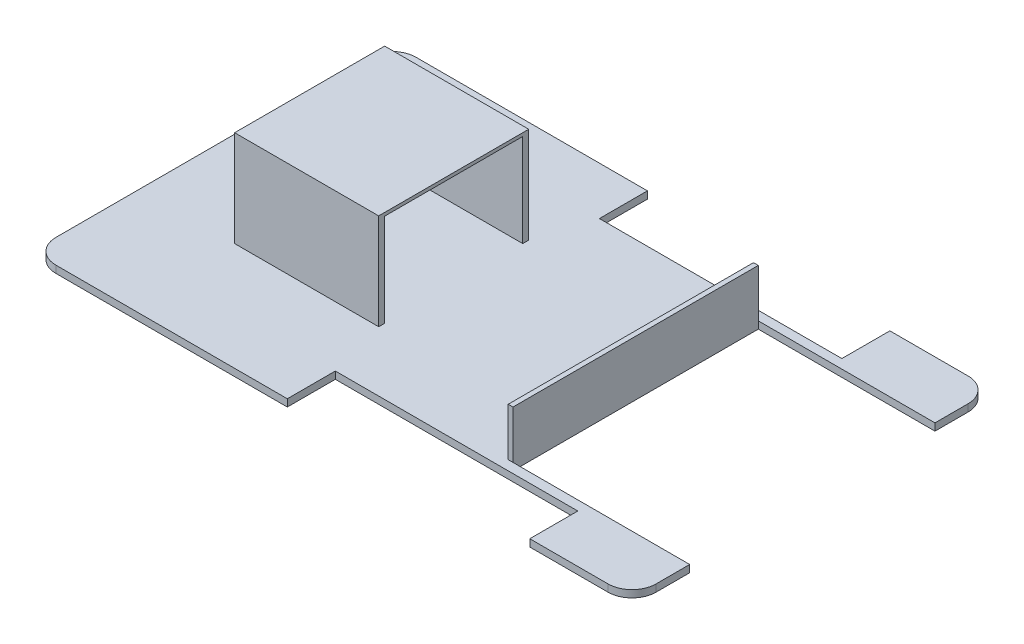
ISO-10303-21;
HEADER;
FILE_DESCRIPTION(('STEP AP214'),'2;1');
FILE_NAME('part.step','',(''),(''),'','','');
FILE_SCHEMA(('AUTOMOTIVE_DESIGN { 1 0 10303 214 1 1 1 1 }'));
ENDSEC;
DATA;
#1=APPLICATION_CONTEXT('core data for automotive mechanical design processes');
#2=APPLICATION_PROTOCOL_DEFINITION('international standard','automotive_design',2000,#1);
#3=PRODUCT_CONTEXT('',#1,'mechanical');
#4=PRODUCT('Part','Part','',(#3));
#5=PRODUCT_RELATED_PRODUCT_CATEGORY('part','',(#4));
#6=PRODUCT_DEFINITION_FORMATION('','',#4);
#7=PRODUCT_DEFINITION_CONTEXT('part definition',#1,'design');
#8=PRODUCT_DEFINITION('design','',#6,#7);
#9=PRODUCT_DEFINITION_SHAPE('','',#8);
#10=(LENGTH_UNIT() NAMED_UNIT(*) SI_UNIT(.MILLI.,.METRE.));
#11=(NAMED_UNIT(*) PLANE_ANGLE_UNIT() SI_UNIT($,.RADIAN.));
#12=(NAMED_UNIT(*) SI_UNIT($,.STERADIAN.) SOLID_ANGLE_UNIT());
#13=UNCERTAINTY_MEASURE_WITH_UNIT(LENGTH_MEASURE(1.E-05),#10,'distance_accuracy_value','');
#14=(GEOMETRIC_REPRESENTATION_CONTEXT(3) GLOBAL_UNCERTAINTY_ASSIGNED_CONTEXT((#13)) GLOBAL_UNIT_ASSIGNED_CONTEXT((#10,
#11,#12)) REPRESENTATION_CONTEXT('',''));
#15=CARTESIAN_POINT('',(0.,0.,0.));
#16=DIRECTION('',(0.,0.,1.));
#17=DIRECTION('',(1.,0.,0.));
#18=AXIS2_PLACEMENT_3D('',#15,#16,#17);
#19=CARTESIAN_POINT('',(0.,3.,0.));
#20=DIRECTION('',(0.,-1.,0.));
#21=DIRECTION('',(0.,0.,-1.));
#22=AXIS2_PLACEMENT_3D('',#19,#20,#21);
#23=PLANE('',#22);
#24=DIRECTION('',(0.,0.,-1.));
#25=VECTOR('',#24,1.);
#26=CARTESIAN_POINT('',(99.4609846046097,3.,-105.));
#27=LINE('',#26,#25);
#28=CARTESIAN_POINT('',(99.4609846046097,3.,-105.));
#29=VERTEX_POINT('',#28);
#30=CARTESIAN_POINT('',(99.4609846046097,3.,-107.5));
#31=VERTEX_POINT('',#30);
#32=EDGE_CURVE('E270',#29,#31,#27,.T.);
#33=ORIENTED_EDGE('',*,*,#32,.F.);
#34=DIRECTION('',(1.,0.,0.));
#35=VECTOR('',#34,1.);
#36=CARTESIAN_POINT('',(99.4609846046097,3.,-105.));
#37=LINE('',#36,#35);
#38=CARTESIAN_POINT('',(39.4609846046098,3.,-105.));
#39=VERTEX_POINT('',#38);
#40=EDGE_CURVE('E279',#39,#29,#37,.T.);
#41=ORIENTED_EDGE('',*,*,#40,.F.);
#42=DIRECTION('',(0.,0.,1.));
#43=VECTOR('',#42,1.);
#44=CARTESIAN_POINT('',(39.4609846046098,3.,-105.));
#45=LINE('',#44,#43);
#46=CARTESIAN_POINT('',(39.4609846046098,3.,-107.5));
#47=VERTEX_POINT('',#46);
#48=EDGE_CURVE('E285',#47,#39,#45,.T.);
#49=ORIENTED_EDGE('',*,*,#48,.F.);
#50=DIRECTION('',(-1.,0.,0.));
#51=VECTOR('',#50,1.);
#52=CARTESIAN_POINT('',(99.4609846046097,3.,-107.5));
#53=LINE('',#52,#51);
#54=EDGE_CURVE('E282',#31,#47,#53,.T.);
#55=ORIENTED_EDGE('',*,*,#54,.F.);
#56=EDGE_LOOP('',(#33,#41,#49,#55));
#57=FACE_BOUND('',#56,.T.);
#58=DIRECTION('',(0.,0.,-1.));
#59=VECTOR('',#58,1.);
#60=CARTESIAN_POINT('',(99.4609846046097,3.,-47.5));
#61=LINE('',#60,#59);
#62=CARTESIAN_POINT('',(99.4609846046097,3.,-45.));
#63=VERTEX_POINT('',#62);
#64=CARTESIAN_POINT('',(99.4609846046097,3.,-47.5));
#65=VERTEX_POINT('',#64);
#66=EDGE_CURVE('E299',#63,#65,#61,.T.);
#67=ORIENTED_EDGE('',*,*,#66,.F.);
#68=DIRECTION('',(1.,0.,0.));
#69=VECTOR('',#68,1.);
#70=CARTESIAN_POINT('',(99.4609846046097,3.,-45.));
#71=LINE('',#70,#69);
#72=CARTESIAN_POINT('',(39.4609846046098,3.,-45.));
#73=VERTEX_POINT('',#72);
#74=EDGE_CURVE('E303',#73,#63,#71,.T.);
#75=ORIENTED_EDGE('',*,*,#74,.F.);
#76=DIRECTION('',(0.,0.,1.));
#77=VECTOR('',#76,1.);
#78=CARTESIAN_POINT('',(39.4609846046098,3.,-47.5));
#79=LINE('',#78,#77);
#80=CARTESIAN_POINT('',(39.4609846046098,3.,-47.5));
#81=VERTEX_POINT('',#80);
#82=EDGE_CURVE('E313',#81,#73,#79,.T.);
#83=ORIENTED_EDGE('',*,*,#82,.F.);
#84=DIRECTION('',(-1.,0.,0.));
#85=VECTOR('',#84,1.);
#86=CARTESIAN_POINT('',(99.4609846046097,3.,-47.5));
#87=LINE('',#86,#85);
#88=EDGE_CURVE('E310',#65,#81,#87,.T.);
#89=ORIENTED_EDGE('',*,*,#88,.F.);
#90=EDGE_LOOP('',(#67,#75,#83,#89));
#91=FACE_BOUND('',#90,.T.);
#92=DIRECTION('',(-1.,0.,0.));
#93=VECTOR('',#92,1.);
#94=CARTESIAN_POINT('',(176.397365129354,3.,-126.191511829194));
#95=LINE('',#94,#93);
#96=CARTESIAN_POINT('',(176.397365129354,3.,-126.191511829194));
#97=VERTEX_POINT('',#96);
#98=CARTESIAN_POINT('',(174.397365129354,3.,-126.191511829194));
#99=VERTEX_POINT('',#98);
#100=EDGE_CURVE('E531',#97,#99,#95,.T.);
#101=ORIENTED_EDGE('',*,*,#100,.F.);
#102=DIRECTION('',(1.,0.,0.));
#103=VECTOR('',#102,1.);
#104=CARTESIAN_POINT('',(250.,3.,-126.191511829194));
#105=LINE('',#104,#103);
#106=CARTESIAN_POINT('',(250.,3.,-126.191511829194));
#107=VERTEX_POINT('',#106);
#108=EDGE_CURVE('E347',#97,#107,#105,.T.);
#109=ORIENTED_EDGE('',*,*,#108,.T.);
#110=DIRECTION('',(0.,0.,-1.));
#111=VECTOR('',#110,1.);
#112=CARTESIAN_POINT('',(250.,3.,-126.191511829194));
#113=LINE('',#112,#111);
#114=CARTESIAN_POINT('',(250.,3.,-140.));
#115=VERTEX_POINT('',#114);
#116=EDGE_CURVE('E349',#107,#115,#113,.T.);
#117=ORIENTED_EDGE('',*,*,#116,.T.);
#118=CARTESIAN_POINT('',(240.,3.,-140.));
#119=DIRECTION('',(0.,-1.,0.));
#120=DIRECTION('',(0.,0.,-1.));
#121=AXIS2_PLACEMENT_3D('',#118,#119,#120);
#122=CIRCLE('',#121,10.);
#123=CARTESIAN_POINT('',(240.,3.,-150.));
#124=VERTEX_POINT('',#123);
#125=EDGE_CURVE('E450',#115,#124,#122,.F.);
#126=ORIENTED_EDGE('',*,*,#125,.T.);
#127=DIRECTION('',(-1.,0.,0.));
#128=VECTOR('',#127,1.);
#129=CARTESIAN_POINT('',(207.407471576062,3.,-150.));
#130=LINE('',#129,#128);
#131=CARTESIAN_POINT('',(207.407471576062,3.,-150.));
#132=VERTEX_POINT('',#131);
#133=EDGE_CURVE('E352',#124,#132,#130,.T.);
#134=ORIENTED_EDGE('',*,*,#133,.T.);
#135=DIRECTION('',(0.,0.,1.));
#136=VECTOR('',#135,1.);
#137=CARTESIAN_POINT('',(207.407471576062,3.,-150.));
#138=LINE('',#137,#136);
#139=CARTESIAN_POINT('',(207.407471576062,3.,-130.));
#140=VERTEX_POINT('',#139);
#141=EDGE_CURVE('E354',#132,#140,#138,.T.);
#142=ORIENTED_EDGE('',*,*,#141,.T.);
#143=DIRECTION('',(-1.,0.,0.));
#144=VECTOR('',#143,1.);
#145=CARTESIAN_POINT('',(106.407471576062,3.,-130.));
#146=LINE('',#145,#144);
#147=CARTESIAN_POINT('',(106.407471576062,3.,-130.));
#148=VERTEX_POINT('',#147);
#149=EDGE_CURVE('E356',#140,#148,#146,.T.);
#150=ORIENTED_EDGE('',*,*,#149,.T.);
#151=DIRECTION('',(0.,0.,-1.));
#152=VECTOR('',#151,1.);
#153=CARTESIAN_POINT('',(106.407471576062,3.,-150.));
#154=LINE('',#153,#152);
#155=CARTESIAN_POINT('',(106.407471576062,3.,-150.));
#156=VERTEX_POINT('',#155);
#157=EDGE_CURVE('E358',#148,#156,#154,.T.);
#158=ORIENTED_EDGE('',*,*,#157,.T.);
#159=DIRECTION('',(-1.,0.,0.));
#160=VECTOR('',#159,1.);
#161=CARTESIAN_POINT('',(0.,3.,-150.));
#162=LINE('',#161,#160);
#163=CARTESIAN_POINT('',(10.,3.,-150.));
#164=VERTEX_POINT('',#163);
#165=EDGE_CURVE('E360',#156,#164,#162,.T.);
#166=ORIENTED_EDGE('',*,*,#165,.T.);
#167=CARTESIAN_POINT('',(10.,3.,-140.));
#168=DIRECTION('',(0.,-1.,0.));
#169=DIRECTION('',(0.,0.,-1.));
#170=AXIS2_PLACEMENT_3D('',#167,#168,#169);
#171=CIRCLE('',#170,10.);
#172=CARTESIAN_POINT('',(0.,3.,-140.));
#173=VERTEX_POINT('',#172);
#174=EDGE_CURVE('E446',#164,#173,#171,.F.);
#175=ORIENTED_EDGE('',*,*,#174,.T.);
#176=DIRECTION('',(0.,0.,1.));
#177=VECTOR('',#176,1.);
#178=CARTESIAN_POINT('',(0.,3.,0.));
#179=LINE('',#178,#177);
#180=CARTESIAN_POINT('',(0.,3.,-10.));
#181=VERTEX_POINT('',#180);
#182=EDGE_CURVE('E328',#173,#181,#179,.T.);
#183=ORIENTED_EDGE('',*,*,#182,.T.);
#184=CARTESIAN_POINT('',(10.,3.,-10.));
#185=DIRECTION('',(0.,-1.,0.));
#186=DIRECTION('',(0.,0.,-1.));
#187=AXIS2_PLACEMENT_3D('',#184,#185,#186);
#188=CIRCLE('',#187,10.);
#189=CARTESIAN_POINT('',(10.,3.,0.));
#190=VERTEX_POINT('',#189);
#191=EDGE_CURVE('E444',#181,#190,#188,.F.);
#192=ORIENTED_EDGE('',*,*,#191,.T.);
#193=DIRECTION('',(1.,0.,0.));
#194=VECTOR('',#193,1.);
#195=CARTESIAN_POINT('',(0.,3.,0.));
#196=LINE('',#195,#194);
#197=CARTESIAN_POINT('',(106.407471576062,3.,0.));
#198=VERTEX_POINT('',#197);
#199=EDGE_CURVE('E331',#190,#198,#196,.T.);
#200=ORIENTED_EDGE('',*,*,#199,.T.);
#201=DIRECTION('',(0.,0.,-1.));
#202=VECTOR('',#201,1.);
#203=CARTESIAN_POINT('',(106.407471576062,3.,-20.));
#204=LINE('',#203,#202);
#205=CARTESIAN_POINT('',(106.407471576062,3.,-20.));
#206=VERTEX_POINT('',#205);
#207=EDGE_CURVE('E334',#198,#206,#204,.T.);
#208=ORIENTED_EDGE('',*,*,#207,.T.);
#209=DIRECTION('',(1.,0.,0.));
#210=VECTOR('',#209,1.);
#211=CARTESIAN_POINT('',(106.407471576062,3.,-20.));
#212=LINE('',#211,#210);
#213=CARTESIAN_POINT('',(207.407471576062,3.,-20.));
#214=VERTEX_POINT('',#213);
#215=EDGE_CURVE('E336',#206,#214,#212,.T.);
#216=ORIENTED_EDGE('',*,*,#215,.T.);
#217=DIRECTION('',(0.,0.,1.));
#218=VECTOR('',#217,1.);
#219=CARTESIAN_POINT('',(207.407471576062,3.,-20.));
#220=LINE('',#219,#218);
#221=CARTESIAN_POINT('',(207.407471576062,3.,0.));
#222=VERTEX_POINT('',#221);
#223=EDGE_CURVE('E338',#214,#222,#220,.T.);
#224=ORIENTED_EDGE('',*,*,#223,.T.);
#225=DIRECTION('',(1.,0.,0.));
#226=VECTOR('',#225,1.);
#227=CARTESIAN_POINT('',(207.407471576062,3.,0.));
#228=LINE('',#227,#226);
#229=CARTESIAN_POINT('',(240.,3.,0.));
#230=VERTEX_POINT('',#229);
#231=EDGE_CURVE('E340',#222,#230,#228,.T.);
#232=ORIENTED_EDGE('',*,*,#231,.T.);
#233=CARTESIAN_POINT('',(240.,3.,-10.));
#234=DIRECTION('',(0.,-1.,0.));
#235=DIRECTION('',(0.,0.,-1.));
#236=AXIS2_PLACEMENT_3D('',#233,#234,#235);
#237=CIRCLE('',#236,10.);
#238=CARTESIAN_POINT('',(250.,3.,-10.));
#239=VERTEX_POINT('',#238);
#240=EDGE_CURVE('E448',#230,#239,#237,.F.);
#241=ORIENTED_EDGE('',*,*,#240,.T.);
#242=DIRECTION('',(0.,0.,-1.));
#243=VECTOR('',#242,1.);
#244=CARTESIAN_POINT('',(250.,3.,0.));
#245=LINE('',#244,#243);
#246=CARTESIAN_POINT('',(250.,3.,-24.0220281720691));
#247=VERTEX_POINT('',#246);
#248=EDGE_CURVE('E343',#239,#247,#245,.T.);
#249=ORIENTED_EDGE('',*,*,#248,.T.);
#250=DIRECTION('',(-1.,0.,0.));
#251=VECTOR('',#250,1.);
#252=CARTESIAN_POINT('',(250.,3.,-24.0220281720691));
#253=LINE('',#252,#251);
#254=CARTESIAN_POINT('',(176.397365129354,3.,-24.0220281720691));
#255=VERTEX_POINT('',#254);
#256=EDGE_CURVE('E345',#247,#255,#253,.T.);
#257=ORIENTED_EDGE('',*,*,#256,.T.);
#258=DIRECTION('',(1.,0.,0.));
#259=VECTOR('',#258,1.);
#260=CARTESIAN_POINT('',(176.397365129354,3.,-24.0220281720691));
#261=LINE('',#260,#259);
#262=CARTESIAN_POINT('',(174.397365129354,3.,-24.0220281720691));
#263=VERTEX_POINT('',#262);
#264=EDGE_CURVE('E53',#263,#255,#261,.T.);
#265=ORIENTED_EDGE('',*,*,#264,.F.);
#266=DIRECTION('',(0.,0.,1.));
#267=VECTOR('',#266,1.);
#268=CARTESIAN_POINT('',(174.397365129354,3.,-126.191511829194));
#269=LINE('',#268,#267);
#270=EDGE_CURVE('E48',#99,#263,#269,.T.);
#271=ORIENTED_EDGE('',*,*,#270,.F.);
#272=EDGE_LOOP('',(#101,#109,#117,#126,#134,#142,#150,#158,#166,#175,#183,#192,#200,#208,#216,
#224,#232,#241,#249,#257,#265,#271));
#273=FACE_BOUND('',#272,.T.);
#274=ADVANCED_FACE('F33',(#57,#91,#273),#23,.F.);
#275=CARTESIAN_POINT('',(99.4609846046097,43.,-47.5));
#276=DIRECTION('',(0.,0.,1.));
#277=DIRECTION('',(1.,0.,0.));
#278=AXIS2_PLACEMENT_3D('',#275,#276,#277);
#279=PLANE('',#278);
#280=DIRECTION('',(-1.,0.,0.));
#281=VECTOR('',#280,1.);
#282=CARTESIAN_POINT('',(99.4609846046097,41.6403706407777,-47.5));
#283=LINE('',#282,#281);
#284=CARTESIAN_POINT('',(99.4609846046097,41.6403706407777,-47.5));
#285=VERTEX_POINT('',#284);
#286=CARTESIAN_POINT('',(39.4609846046098,41.6403706407777,-47.5));
#287=VERTEX_POINT('',#286);
#288=EDGE_CURVE('E268',#285,#287,#283,.T.);
#289=ORIENTED_EDGE('',*,*,#288,.F.);
#290=DIRECTION('',(0.,-1.,0.));
#291=VECTOR('',#290,1.);
#292=CARTESIAN_POINT('',(99.4609846046097,43.,-47.5));
#293=LINE('',#292,#291);
#294=EDGE_CURVE('E325',#285,#65,#293,.T.);
#295=ORIENTED_EDGE('',*,*,#294,.T.);
#296=ORIENTED_EDGE('',*,*,#88,.T.);
#297=DIRECTION('',(0.,-1.,0.));
#298=VECTOR('',#297,1.);
#299=CARTESIAN_POINT('',(39.4609846046098,43.,-47.5));
#300=LINE('',#299,#298);
#301=EDGE_CURVE('E323',#287,#81,#300,.T.);
#302=ORIENTED_EDGE('',*,*,#301,.F.);
#303=EDGE_LOOP('',(#289,#295,#296,#302));
#304=FACE_BOUND('',#303,.T.);
#305=ADVANCED_FACE('F546',(#304),#279,.F.);
#306=CARTESIAN_POINT('',(99.4609846046097,43.,-105.));
#307=DIRECTION('',(0.,0.,-1.));
#308=DIRECTION('',(-1.,0.,0.));
#309=AXIS2_PLACEMENT_3D('',#306,#307,#308);
#310=PLANE('',#309);
#311=DIRECTION('',(-1.,0.,0.));
#312=VECTOR('',#311,1.);
#313=CARTESIAN_POINT('',(99.4609846046097,41.6403706407777,-105.));
#314=LINE('',#313,#312);
#315=CARTESIAN_POINT('',(99.4609846046097,41.6403706407777,-105.));
#316=VERTEX_POINT('',#315);
#317=CARTESIAN_POINT('',(39.4609846046098,41.6403706407777,-105.));
#318=VERTEX_POINT('',#317);
#319=EDGE_CURVE('E259',#316,#318,#314,.T.);
#320=ORIENTED_EDGE('',*,*,#319,.T.);
#321=DIRECTION('',(0.,-1.,0.));
#322=VECTOR('',#321,1.);
#323=CARTESIAN_POINT('',(39.4609846046098,43.,-105.));
#324=LINE('',#323,#322);
#325=EDGE_CURVE('E291',#318,#39,#324,.T.);
#326=ORIENTED_EDGE('',*,*,#325,.T.);
#327=ORIENTED_EDGE('',*,*,#40,.T.);
#328=DIRECTION('',(0.,-1.,0.));
#329=VECTOR('',#328,1.);
#330=CARTESIAN_POINT('',(99.4609846046097,43.,-105.));
#331=LINE('',#330,#329);
#332=EDGE_CURVE('E278',#316,#29,#331,.T.);
#333=ORIENTED_EDGE('',*,*,#332,.F.);
#334=EDGE_LOOP('',(#320,#326,#327,#333));
#335=FACE_BOUND('',#334,.T.);
#336=ADVANCED_FACE('F552',(#335),#310,.F.);
#337=CARTESIAN_POINT('',(0.,3.,0.));
#338=DIRECTION('',(1.,0.,0.));
#339=DIRECTION('',(0.,0.,-1.));
#340=AXIS2_PLACEMENT_3D('',#337,#338,#339);
#341=PLANE('',#340);
#342=ORIENTED_EDGE('',*,*,#182,.F.);
#343=DIRECTION('',(0.,-1.,0.));
#344=VECTOR('',#343,1.);
#345=CARTESIAN_POINT('',(0.,3.,-140.));
#346=LINE('',#345,#344);
#347=CARTESIAN_POINT('',(0.,0.,-140.));
#348=VERTEX_POINT('',#347);
#349=EDGE_CURVE('E459',#173,#348,#346,.T.);
#350=ORIENTED_EDGE('',*,*,#349,.T.);
#351=DIRECTION('',(0.,0.,1.));
#352=VECTOR('',#351,1.);
#353=CARTESIAN_POINT('',(0.,0.,0.));
#354=LINE('',#353,#352);
#355=CARTESIAN_POINT('',(0.,0.,-10.));
#356=VERTEX_POINT('',#355);
#357=EDGE_CURVE('E327',#348,#356,#354,.T.);
#358=ORIENTED_EDGE('',*,*,#357,.T.);
#359=DIRECTION('',(0.,-1.,0.));
#360=VECTOR('',#359,1.);
#361=CARTESIAN_POINT('',(0.,3.,-10.));
#362=LINE('',#361,#360);
#363=EDGE_CURVE('E457',#356,#181,#362,.F.);
#364=ORIENTED_EDGE('',*,*,#363,.T.);
#365=EDGE_LOOP('',(#342,#350,#358,#364));
#366=FACE_BOUND('',#365,.T.);
#367=ADVANCED_FACE('F475',(#366),#341,.F.);
#368=CARTESIAN_POINT('',(0.,3.,0.));
#369=DIRECTION('',(0.,0.,-1.));
#370=DIRECTION('',(-1.,0.,0.));
#371=AXIS2_PLACEMENT_3D('',#368,#369,#370);
#372=PLANE('',#371);
#373=ORIENTED_EDGE('',*,*,#199,.F.);
#374=DIRECTION('',(0.,-1.,0.));
#375=VECTOR('',#374,1.);
#376=CARTESIAN_POINT('',(10.,3.,0.));
#377=LINE('',#376,#375);
#378=CARTESIAN_POINT('',(10.,0.,0.));
#379=VERTEX_POINT('',#378);
#380=EDGE_CURVE('E11',#190,#379,#377,.T.);
#381=ORIENTED_EDGE('',*,*,#380,.T.);
#382=DIRECTION('',(1.,0.,0.));
#383=VECTOR('',#382,1.);
#384=CARTESIAN_POINT('',(0.,0.,0.));
#385=LINE('',#384,#383);
#386=CARTESIAN_POINT('',(106.407471576062,0.,0.));
#387=VERTEX_POINT('',#386);
#388=EDGE_CURVE('E366',#379,#387,#385,.T.);
#389=ORIENTED_EDGE('',*,*,#388,.T.);
#390=DIRECTION('',(0.,-1.,0.));
#391=VECTOR('',#390,1.);
#392=CARTESIAN_POINT('',(106.407471576062,3.,0.));
#393=LINE('',#392,#391);
#394=EDGE_CURVE('E428',#198,#387,#393,.T.);
#395=ORIENTED_EDGE('',*,*,#394,.F.);
#396=EDGE_LOOP('',(#373,#381,#389,#395));
#397=FACE_BOUND('',#396,.T.);
#398=ADVANCED_FACE('F487',(#397),#372,.F.);
#399=CARTESIAN_POINT('',(106.407471576062,3.,-20.));
#400=DIRECTION('',(-1.,0.,0.));
#401=DIRECTION('',(0.,0.,1.));
#402=AXIS2_PLACEMENT_3D('',#399,#400,#401);
#403=PLANE('',#402);
#404=DIRECTION('',(0.,0.,-1.));
#405=VECTOR('',#404,1.);
#406=CARTESIAN_POINT('',(106.407471576062,0.,-20.));
#407=LINE('',#406,#405);
#408=CARTESIAN_POINT('',(106.407471576062,0.,-20.));
#409=VERTEX_POINT('',#408);
#410=EDGE_CURVE('E368',#387,#409,#407,.T.);
#411=ORIENTED_EDGE('',*,*,#410,.T.);
#412=DIRECTION('',(0.,-1.,0.));
#413=VECTOR('',#412,1.);
#414=CARTESIAN_POINT('',(106.407471576062,3.,-20.));
#415=LINE('',#414,#413);
#416=EDGE_CURVE('E425',#206,#409,#415,.T.);
#417=ORIENTED_EDGE('',*,*,#416,.F.);
#418=ORIENTED_EDGE('',*,*,#207,.F.);
#419=ORIENTED_EDGE('',*,*,#394,.T.);
#420=EDGE_LOOP('',(#411,#417,#418,#419));
#421=FACE_BOUND('',#420,.T.);
#422=ADVANCED_FACE('F494',(#421),#403,.F.);
#423=CARTESIAN_POINT('',(106.407471576062,3.,-20.));
#424=DIRECTION('',(0.,0.,-1.));
#425=DIRECTION('',(-1.,0.,0.));
#426=AXIS2_PLACEMENT_3D('',#423,#424,#425);
#427=PLANE('',#426);
#428=DIRECTION('',(1.,0.,0.));
#429=VECTOR('',#428,1.);
#430=CARTESIAN_POINT('',(106.407471576062,0.,-20.));
#431=LINE('',#430,#429);
#432=CARTESIAN_POINT('',(207.407471576062,0.,-20.));
#433=VERTEX_POINT('',#432);
#434=EDGE_CURVE('E370',#409,#433,#431,.T.);
#435=ORIENTED_EDGE('',*,*,#434,.T.);
#436=DIRECTION('',(0.,-1.,0.));
#437=VECTOR('',#436,1.);
#438=CARTESIAN_POINT('',(207.407471576062,3.,-20.));
#439=LINE('',#438,#437);
#440=EDGE_CURVE('E422',#214,#433,#439,.T.);
#441=ORIENTED_EDGE('',*,*,#440,.F.);
#442=ORIENTED_EDGE('',*,*,#215,.F.);
#443=ORIENTED_EDGE('',*,*,#416,.T.);
#444=EDGE_LOOP('',(#435,#441,#442,#443));
#445=FACE_BOUND('',#444,.T.);
#446=ADVANCED_FACE('F497',(#445),#427,.F.);
#447=CARTESIAN_POINT('',(207.407471576062,3.,-20.));
#448=DIRECTION('',(1.,0.,0.));
#449=DIRECTION('',(0.,0.,-1.));
#450=AXIS2_PLACEMENT_3D('',#447,#448,#449);
#451=PLANE('',#450);
#452=DIRECTION('',(0.,0.,1.));
#453=VECTOR('',#452,1.);
#454=CARTESIAN_POINT('',(207.407471576062,0.,-20.));
#455=LINE('',#454,#453);
#456=CARTESIAN_POINT('',(207.407471576062,0.,0.));
#457=VERTEX_POINT('',#456);
#458=EDGE_CURVE('E372',#433,#457,#455,.T.);
#459=ORIENTED_EDGE('',*,*,#458,.T.);
#460=DIRECTION('',(0.,-1.,0.));
#461=VECTOR('',#460,1.);
#462=CARTESIAN_POINT('',(207.407471576062,3.,0.));
#463=LINE('',#462,#461);
#464=EDGE_CURVE('E419',#222,#457,#463,.T.);
#465=ORIENTED_EDGE('',*,*,#464,.F.);
#466=ORIENTED_EDGE('',*,*,#223,.F.);
#467=ORIENTED_EDGE('',*,*,#440,.T.);
#468=EDGE_LOOP('',(#459,#465,#466,#467));
#469=FACE_BOUND('',#468,.T.);
#470=ADVANCED_FACE('F502',(#469),#451,.F.);
#471=CARTESIAN_POINT('',(207.407471576062,3.,0.));
#472=DIRECTION('',(0.,0.,-1.));
#473=DIRECTION('',(-1.,0.,0.));
#474=AXIS2_PLACEMENT_3D('',#471,#472,#473);
#475=PLANE('',#474);
#476=DIRECTION('',(1.,0.,0.));
#477=VECTOR('',#476,1.);
#478=CARTESIAN_POINT('',(207.407471576062,0.,0.));
#479=LINE('',#478,#477);
#480=CARTESIAN_POINT('',(240.,0.,0.));
#481=VERTEX_POINT('',#480);
#482=EDGE_CURVE('E374',#457,#481,#479,.T.);
#483=ORIENTED_EDGE('',*,*,#482,.T.);
#484=DIRECTION('',(0.,-1.,0.));
#485=VECTOR('',#484,1.);
#486=CARTESIAN_POINT('',(240.,3.,0.));
#487=LINE('',#486,#485);
#488=EDGE_CURVE('E455',#481,#230,#487,.F.);
#489=ORIENTED_EDGE('',*,*,#488,.T.);
#490=ORIENTED_EDGE('',*,*,#231,.F.);
#491=ORIENTED_EDGE('',*,*,#464,.T.);
#492=EDGE_LOOP('',(#483,#489,#490,#491));
#493=FACE_BOUND('',#492,.T.);
#494=ADVANCED_FACE('F594',(#493),#475,.F.);
#495=CARTESIAN_POINT('',(250.,3.,0.));
#496=DIRECTION('',(-1.,0.,0.));
#497=DIRECTION('',(0.,0.,1.));
#498=AXIS2_PLACEMENT_3D('',#495,#496,#497);
#499=PLANE('',#498);
#500=ORIENTED_EDGE('',*,*,#248,.F.);
#501=DIRECTION('',(0.,-1.,0.));
#502=VECTOR('',#501,1.);
#503=CARTESIAN_POINT('',(250.,3.,-10.));
#504=LINE('',#503,#502);
#505=CARTESIAN_POINT('',(250.,0.,-10.));
#506=VERTEX_POINT('',#505);
#507=EDGE_CURVE('E452',#239,#506,#504,.T.);
#508=ORIENTED_EDGE('',*,*,#507,.T.);
#509=DIRECTION('',(0.,0.,-1.));
#510=VECTOR('',#509,1.);
#511=CARTESIAN_POINT('',(250.,0.,0.));
#512=LINE('',#511,#510);
#513=CARTESIAN_POINT('',(250.,0.,-24.0220281720691));
#514=VERTEX_POINT('',#513);
#515=EDGE_CURVE('E377',#506,#514,#512,.T.);
#516=ORIENTED_EDGE('',*,*,#515,.T.);
#517=DIRECTION('',(0.,-1.,0.));
#518=VECTOR('',#517,1.);
#519=CARTESIAN_POINT('',(250.,3.,-24.0220281720691));
#520=LINE('',#519,#518);
#521=EDGE_CURVE('E416',#247,#514,#520,.T.);
#522=ORIENTED_EDGE('',*,*,#521,.F.);
#523=EDGE_LOOP('',(#500,#508,#516,#522));
#524=FACE_BOUND('',#523,.T.);
#525=ADVANCED_FACE('F513',(#524),#499,.F.);
#526=CARTESIAN_POINT('',(250.,3.,-24.0220281720691));
#527=DIRECTION('',(0.,0.,1.));
#528=DIRECTION('',(1.,0.,0.));
#529=AXIS2_PLACEMENT_3D('',#526,#527,#528);
#530=PLANE('',#529);
#531=DIRECTION('',(-1.,0.,0.));
#532=VECTOR('',#531,1.);
#533=CARTESIAN_POINT('',(250.,0.,-24.0220281720691));
#534=LINE('',#533,#532);
#535=CARTESIAN_POINT('',(176.397365129354,0.,-24.0220281720691));
#536=VERTEX_POINT('',#535);
#537=EDGE_CURVE('E379',#514,#536,#534,.T.);
#538=ORIENTED_EDGE('',*,*,#537,.T.);
#539=DIRECTION('',(0.,-1.,0.));
#540=VECTOR('',#539,1.);
#541=CARTESIAN_POINT('',(176.397365129354,3.,-24.0220281720691));
#542=LINE('',#541,#540);
#543=EDGE_CURVE('E413',#255,#536,#542,.T.);
#544=ORIENTED_EDGE('',*,*,#543,.F.);
#545=ORIENTED_EDGE('',*,*,#256,.F.);
#546=ORIENTED_EDGE('',*,*,#521,.T.);
#547=EDGE_LOOP('',(#538,#544,#545,#546));
#548=FACE_BOUND('',#547,.T.);
#549=ADVANCED_FACE('F521',(#548),#530,.F.);
#550=CARTESIAN_POINT('',(176.397365129354,3.,-126.191511829194));
#551=DIRECTION('',(-1.,0.,0.));
#552=DIRECTION('',(0.,0.,1.));
#553=AXIS2_PLACEMENT_3D('',#550,#551,#552);
#554=PLANE('',#553);
#555=DIRECTION('',(0.,0.,-1.));
#556=VECTOR('',#555,1.);
#557=CARTESIAN_POINT('',(176.397365129354,0.,-126.191511829194));
#558=LINE('',#557,#556);
#559=CARTESIAN_POINT('',(176.397365129354,0.,-126.191511829194));
#560=VERTEX_POINT('',#559);
#561=EDGE_CURVE('E381',#536,#560,#558,.T.);
#562=ORIENTED_EDGE('',*,*,#561,.T.);
#563=DIRECTION('',(0.,-1.,0.));
#564=VECTOR('',#563,1.);
#565=CARTESIAN_POINT('',(176.397365129354,3.,-126.191511829194));
#566=LINE('',#565,#564);
#567=EDGE_CURVE('E258',#97,#560,#566,.T.);
#568=ORIENTED_EDGE('',*,*,#567,.F.);
#569=DIRECTION('',(0.,-1.,0.));
#570=VECTOR('',#569,1.);
#571=CARTESIAN_POINT('',(176.397365129354,23.,-126.191511829194));
#572=LINE('',#571,#570);
#573=CARTESIAN_POINT('',(176.397365129354,23.,-126.191511829194));
#574=VERTEX_POINT('',#573);
#575=EDGE_CURVE('E239',#574,#97,#572,.T.);
#576=ORIENTED_EDGE('',*,*,#575,.F.);
#577=DIRECTION('',(0.,0.,-1.));
#578=VECTOR('',#577,1.);
#579=CARTESIAN_POINT('',(176.397365129354,23.,-126.191511829194));
#580=LINE('',#579,#578);
#581=CARTESIAN_POINT('',(176.397365129354,23.,-24.0220281720691));
#582=VERTEX_POINT('',#581);
#583=EDGE_CURVE('E245',#582,#574,#580,.T.);
#584=ORIENTED_EDGE('',*,*,#583,.F.);
#585=DIRECTION('',(0.,-1.,0.));
#586=VECTOR('',#585,1.);
#587=CARTESIAN_POINT('',(176.397365129354,23.,-24.0220281720691));
#588=LINE('',#587,#586);
#589=EDGE_CURVE('E523',#582,#255,#588,.T.);
#590=ORIENTED_EDGE('',*,*,#589,.T.);
#591=ORIENTED_EDGE('',*,*,#543,.T.);
#592=EDGE_LOOP('',(#562,#568,#576,#584,#590,#591));
#593=FACE_BOUND('',#592,.T.);
#594=ADVANCED_FACE('F256',(#593),#554,.F.);
#595=CARTESIAN_POINT('',(250.,3.,-126.191511829194));
#596=DIRECTION('',(0.,0.,-1.));
#597=DIRECTION('',(-1.,0.,0.));
#598=AXIS2_PLACEMENT_3D('',#595,#596,#597);
#599=PLANE('',#598);
#600=DIRECTION('',(1.,0.,0.));
#601=VECTOR('',#600,1.);
#602=CARTESIAN_POINT('',(250.,0.,-126.191511829194));
#603=LINE('',#602,#601);
#604=CARTESIAN_POINT('',(250.,0.,-126.191511829194));
#605=VERTEX_POINT('',#604);
#606=EDGE_CURVE('E383',#560,#605,#603,.T.);
#607=ORIENTED_EDGE('',*,*,#606,.T.);
#608=DIRECTION('',(0.,-1.,0.));
#609=VECTOR('',#608,1.);
#610=CARTESIAN_POINT('',(250.,3.,-126.191511829194));
#611=LINE('',#610,#609);
#612=EDGE_CURVE('E409',#107,#605,#611,.T.);
#613=ORIENTED_EDGE('',*,*,#612,.F.);
#614=ORIENTED_EDGE('',*,*,#108,.F.);
#615=ORIENTED_EDGE('',*,*,#567,.T.);
#616=EDGE_LOOP('',(#607,#613,#614,#615));
#617=FACE_BOUND('',#616,.T.);
#618=ADVANCED_FACE('F583',(#617),#599,.F.);
#619=CARTESIAN_POINT('',(250.,3.,-126.191511829194));
#620=DIRECTION('',(-1.,0.,0.));
#621=DIRECTION('',(0.,0.,1.));
#622=AXIS2_PLACEMENT_3D('',#619,#620,#621);
#623=PLANE('',#622);
#624=DIRECTION('',(0.,0.,-1.));
#625=VECTOR('',#624,1.);
#626=CARTESIAN_POINT('',(250.,0.,-126.191511829194));
#627=LINE('',#626,#625);
#628=CARTESIAN_POINT('',(250.,0.,-140.));
#629=VERTEX_POINT('',#628);
#630=EDGE_CURVE('E385',#605,#629,#627,.T.);
#631=ORIENTED_EDGE('',*,*,#630,.T.);
#632=DIRECTION('',(0.,-1.,0.));
#633=VECTOR('',#632,1.);
#634=CARTESIAN_POINT('',(250.,3.,-140.));
#635=LINE('',#634,#633);
#636=EDGE_CURVE('E442',#629,#115,#635,.F.);
#637=ORIENTED_EDGE('',*,*,#636,.T.);
#638=ORIENTED_EDGE('',*,*,#116,.F.);
#639=ORIENTED_EDGE('',*,*,#612,.T.);
#640=EDGE_LOOP('',(#631,#637,#638,#639));
#641=FACE_BOUND('',#640,.T.);
#642=ADVANCED_FACE('F579',(#641),#623,.F.);
#643=CARTESIAN_POINT('',(207.407471576062,3.,-150.));
#644=DIRECTION('',(0.,0.,1.));
#645=DIRECTION('',(1.,0.,0.));
#646=AXIS2_PLACEMENT_3D('',#643,#644,#645);
#647=PLANE('',#646);
#648=ORIENTED_EDGE('',*,*,#133,.F.);
#649=DIRECTION('',(0.,-1.,0.));
#650=VECTOR('',#649,1.);
#651=CARTESIAN_POINT('',(240.,3.,-150.));
#652=LINE('',#651,#650);
#653=CARTESIAN_POINT('',(240.,0.,-150.));
#654=VERTEX_POINT('',#653);
#655=EDGE_CURVE('E431',#124,#654,#652,.T.);
#656=ORIENTED_EDGE('',*,*,#655,.T.);
#657=DIRECTION('',(-1.,0.,0.));
#658=VECTOR('',#657,1.);
#659=CARTESIAN_POINT('',(207.407471576062,0.,-150.));
#660=LINE('',#659,#658);
#661=CARTESIAN_POINT('',(207.407471576062,0.,-150.));
#662=VERTEX_POINT('',#661);
#663=EDGE_CURVE('E388',#654,#662,#660,.T.);
#664=ORIENTED_EDGE('',*,*,#663,.T.);
#665=DIRECTION('',(0.,-1.,0.));
#666=VECTOR('',#665,1.);
#667=CARTESIAN_POINT('',(207.407471576062,3.,-150.));
#668=LINE('',#667,#666);
#669=EDGE_CURVE('E406',#132,#662,#668,.T.);
#670=ORIENTED_EDGE('',*,*,#669,.F.);
#671=EDGE_LOOP('',(#648,#656,#664,#670));
#672=FACE_BOUND('',#671,.T.);
#673=ADVANCED_FACE('F575',(#672),#647,.F.);
#674=CARTESIAN_POINT('',(207.407471576062,3.,-150.));
#675=DIRECTION('',(1.,0.,0.));
#676=DIRECTION('',(0.,0.,-1.));
#677=AXIS2_PLACEMENT_3D('',#674,#675,#676);
#678=PLANE('',#677);
#679=DIRECTION('',(0.,0.,1.));
#680=VECTOR('',#679,1.);
#681=CARTESIAN_POINT('',(207.407471576062,0.,-150.));
#682=LINE('',#681,#680);
#683=CARTESIAN_POINT('',(207.407471576062,0.,-130.));
#684=VERTEX_POINT('',#683);
#685=EDGE_CURVE('E390',#662,#684,#682,.T.);
#686=ORIENTED_EDGE('',*,*,#685,.T.);
#687=DIRECTION('',(0.,-1.,0.));
#688=VECTOR('',#687,1.);
#689=CARTESIAN_POINT('',(207.407471576062,3.,-130.));
#690=LINE('',#689,#688);
#691=EDGE_CURVE('E403',#140,#684,#690,.T.);
#692=ORIENTED_EDGE('',*,*,#691,.F.);
#693=ORIENTED_EDGE('',*,*,#141,.F.);
#694=ORIENTED_EDGE('',*,*,#669,.T.);
#695=EDGE_LOOP('',(#686,#692,#693,#694));
#696=FACE_BOUND('',#695,.T.);
#697=ADVANCED_FACE('F571',(#696),#678,.F.);
#698=CARTESIAN_POINT('',(106.407471576062,3.,-130.));
#699=DIRECTION('',(0.,0.,1.));
#700=DIRECTION('',(1.,0.,0.));
#701=AXIS2_PLACEMENT_3D('',#698,#699,#700);
#702=PLANE('',#701);
#703=DIRECTION('',(-1.,0.,0.));
#704=VECTOR('',#703,1.);
#705=CARTESIAN_POINT('',(106.407471576062,0.,-130.));
#706=LINE('',#705,#704);
#707=CARTESIAN_POINT('',(106.407471576062,0.,-130.));
#708=VERTEX_POINT('',#707);
#709=EDGE_CURVE('E392',#684,#708,#706,.T.);
#710=ORIENTED_EDGE('',*,*,#709,.T.);
#711=DIRECTION('',(0.,-1.,0.));
#712=VECTOR('',#711,1.);
#713=CARTESIAN_POINT('',(106.407471576062,3.,-130.));
#714=LINE('',#713,#712);
#715=EDGE_CURVE('E400',#148,#708,#714,.T.);
#716=ORIENTED_EDGE('',*,*,#715,.F.);
#717=ORIENTED_EDGE('',*,*,#149,.F.);
#718=ORIENTED_EDGE('',*,*,#691,.T.);
#719=EDGE_LOOP('',(#710,#716,#717,#718));
#720=FACE_BOUND('',#719,.T.);
#721=ADVANCED_FACE('F567',(#720),#702,.F.);
#722=CARTESIAN_POINT('',(106.407471576062,3.,-150.));
#723=DIRECTION('',(-1.,0.,0.));
#724=DIRECTION('',(0.,0.,1.));
#725=AXIS2_PLACEMENT_3D('',#722,#723,#724);
#726=PLANE('',#725);
#727=DIRECTION('',(0.,0.,-1.));
#728=VECTOR('',#727,1.);
#729=CARTESIAN_POINT('',(106.407471576062,0.,-150.));
#730=LINE('',#729,#728);
#731=CARTESIAN_POINT('',(106.407471576062,0.,-150.));
#732=VERTEX_POINT('',#731);
#733=EDGE_CURVE('E394',#708,#732,#730,.T.);
#734=ORIENTED_EDGE('',*,*,#733,.T.);
#735=DIRECTION('',(0.,-1.,0.));
#736=VECTOR('',#735,1.);
#737=CARTESIAN_POINT('',(106.407471576062,3.,-150.));
#738=LINE('',#737,#736);
#739=EDGE_CURVE('E363',#156,#732,#738,.T.);
#740=ORIENTED_EDGE('',*,*,#739,.F.);
#741=ORIENTED_EDGE('',*,*,#157,.F.);
#742=ORIENTED_EDGE('',*,*,#715,.T.);
#743=EDGE_LOOP('',(#734,#740,#741,#742));
#744=FACE_BOUND('',#743,.T.);
#745=ADVANCED_FACE('F564',(#744),#726,.F.);
#746=CARTESIAN_POINT('',(0.,3.,-150.));
#747=DIRECTION('',(0.,0.,1.));
#748=DIRECTION('',(1.,0.,0.));
#749=AXIS2_PLACEMENT_3D('',#746,#747,#748);
#750=PLANE('',#749);
#751=DIRECTION('',(-1.,0.,0.));
#752=VECTOR('',#751,1.);
#753=CARTESIAN_POINT('',(0.,0.,-150.));
#754=LINE('',#753,#752);
#755=CARTESIAN_POINT('',(10.,0.,-150.));
#756=VERTEX_POINT('',#755);
#757=EDGE_CURVE('E332',#732,#756,#754,.T.);
#758=ORIENTED_EDGE('',*,*,#757,.T.);
#759=DIRECTION('',(0.,-1.,0.));
#760=VECTOR('',#759,1.);
#761=CARTESIAN_POINT('',(10.,3.,-150.));
#762=LINE('',#761,#760);
#763=EDGE_CURVE('E41',#756,#164,#762,.F.);
#764=ORIENTED_EDGE('',*,*,#763,.T.);
#765=ORIENTED_EDGE('',*,*,#165,.F.);
#766=ORIENTED_EDGE('',*,*,#739,.T.);
#767=EDGE_LOOP('',(#758,#764,#765,#766));
#768=FACE_BOUND('',#767,.T.);
#769=ADVANCED_FACE('F464',(#768),#750,.F.);
#770=CARTESIAN_POINT('',(0.,0.,0.));
#771=DIRECTION('',(0.,-1.,0.));
#772=DIRECTION('',(0.,0.,-1.));
#773=AXIS2_PLACEMENT_3D('',#770,#771,#772);
#774=PLANE('',#773);
#775=ORIENTED_EDGE('',*,*,#663,.F.);
#776=CARTESIAN_POINT('',(240.,0.,-140.));
#777=DIRECTION('',(0.,-1.,0.));
#778=DIRECTION('',(0.,0.,-1.));
#779=AXIS2_PLACEMENT_3D('',#776,#777,#778);
#780=CIRCLE('',#779,10.);
#781=EDGE_CURVE('E440',#654,#629,#780,.T.);
#782=ORIENTED_EDGE('',*,*,#781,.T.);
#783=ORIENTED_EDGE('',*,*,#630,.F.);
#784=ORIENTED_EDGE('',*,*,#606,.F.);
#785=ORIENTED_EDGE('',*,*,#561,.F.);
#786=ORIENTED_EDGE('',*,*,#537,.F.);
#787=ORIENTED_EDGE('',*,*,#515,.F.);
#788=CARTESIAN_POINT('',(240.,0.,-10.));
#789=DIRECTION('',(0.,-1.,0.));
#790=DIRECTION('',(0.,0.,-1.));
#791=AXIS2_PLACEMENT_3D('',#788,#789,#790);
#792=CIRCLE('',#791,10.);
#793=EDGE_CURVE('E438',#506,#481,#792,.T.);
#794=ORIENTED_EDGE('',*,*,#793,.T.);
#795=ORIENTED_EDGE('',*,*,#482,.F.);
#796=ORIENTED_EDGE('',*,*,#458,.F.);
#797=ORIENTED_EDGE('',*,*,#434,.F.);
#798=ORIENTED_EDGE('',*,*,#410,.F.);
#799=ORIENTED_EDGE('',*,*,#388,.F.);
#800=CARTESIAN_POINT('',(10.,0.,-10.));
#801=DIRECTION('',(0.,-1.,0.));
#802=DIRECTION('',(0.,0.,-1.));
#803=AXIS2_PLACEMENT_3D('',#800,#801,#802);
#804=CIRCLE('',#803,10.);
#805=EDGE_CURVE('E434',#379,#356,#804,.T.);
#806=ORIENTED_EDGE('',*,*,#805,.T.);
#807=ORIENTED_EDGE('',*,*,#357,.F.);
#808=CARTESIAN_POINT('',(10.,0.,-140.));
#809=DIRECTION('',(0.,-1.,0.));
#810=DIRECTION('',(0.,0.,-1.));
#811=AXIS2_PLACEMENT_3D('',#808,#809,#810);
#812=CIRCLE('',#811,10.);
#813=EDGE_CURVE('E436',#348,#756,#812,.T.);
#814=ORIENTED_EDGE('',*,*,#813,.T.);
#815=ORIENTED_EDGE('',*,*,#757,.F.);
#816=ORIENTED_EDGE('',*,*,#733,.F.);
#817=ORIENTED_EDGE('',*,*,#709,.F.);
#818=ORIENTED_EDGE('',*,*,#685,.F.);
#819=EDGE_LOOP('',(#775,#782,#783,#784,#785,#786,#787,#794,#795,#796,#797,#798,#799,#806,#807,
#814,#815,#816,#817,#818));
#820=FACE_BOUND('',#819,.T.);
#821=ADVANCED_FACE('F479',(#820),#774,.T.);
#822=CARTESIAN_POINT('',(99.4609846046097,43.,-47.5));
#823=DIRECTION('',(-1.,0.,0.));
#824=DIRECTION('',(0.,0.,1.));
#825=AXIS2_PLACEMENT_3D('',#822,#823,#824);
#826=PLANE('',#825);
#827=ORIENTED_EDGE('',*,*,#66,.T.);
#828=ORIENTED_EDGE('',*,*,#294,.F.);
#829=DIRECTION('',(0.,0.,1.));
#830=VECTOR('',#829,1.);
#831=CARTESIAN_POINT('',(99.4609846046097,41.6403706407777,-165.015402956195));
#832=LINE('',#831,#830);
#833=EDGE_CURVE('E271',#316,#285,#832,.T.);
#834=ORIENTED_EDGE('',*,*,#833,.F.);
#835=ORIENTED_EDGE('',*,*,#332,.T.);
#836=ORIENTED_EDGE('',*,*,#32,.T.);
#837=DIRECTION('',(0.,-1.,0.));
#838=VECTOR('',#837,1.);
#839=CARTESIAN_POINT('',(99.4609846046097,43.,-107.5));
#840=LINE('',#839,#838);
#841=CARTESIAN_POINT('',(99.4609846046097,43.,-107.5));
#842=VERTEX_POINT('',#841);
#843=EDGE_CURVE('E296',#842,#31,#840,.T.);
#844=ORIENTED_EDGE('',*,*,#843,.F.);
#845=DIRECTION('',(0.,0.,-1.));
#846=VECTOR('',#845,1.);
#847=CARTESIAN_POINT('',(99.4609846046097,43.,-47.5));
#848=LINE('',#847,#846);
#849=CARTESIAN_POINT('',(99.4609846046097,43.,-45.));
#850=VERTEX_POINT('',#849);
#851=EDGE_CURVE('E300',#850,#842,#848,.T.);
#852=ORIENTED_EDGE('',*,*,#851,.F.);
#853=DIRECTION('',(0.,-1.,0.));
#854=VECTOR('',#853,1.);
#855=CARTESIAN_POINT('',(99.4609846046097,43.,-45.));
#856=LINE('',#855,#854);
#857=EDGE_CURVE('E307',#850,#63,#856,.T.);
#858=ORIENTED_EDGE('',*,*,#857,.T.);
#859=EDGE_LOOP('',(#827,#828,#834,#835,#836,#844,#852,#858));
#860=FACE_BOUND('',#859,.T.);
#861=ADVANCED_FACE('F559',(#860),#826,.F.);
#862=CARTESIAN_POINT('',(39.4609846046098,43.,-47.5));
#863=DIRECTION('',(1.,0.,0.));
#864=DIRECTION('',(0.,0.,-1.));
#865=AXIS2_PLACEMENT_3D('',#862,#863,#864);
#866=PLANE('',#865);
#867=ORIENTED_EDGE('',*,*,#82,.T.);
#868=DIRECTION('',(0.,-1.,0.));
#869=VECTOR('',#868,1.);
#870=CARTESIAN_POINT('',(39.4609846046098,43.,-45.));
#871=LINE('',#870,#869);
#872=CARTESIAN_POINT('',(39.4609846046098,43.,-45.));
#873=VERTEX_POINT('',#872);
#874=EDGE_CURVE('E320',#873,#73,#871,.T.);
#875=ORIENTED_EDGE('',*,*,#874,.F.);
#876=DIRECTION('',(0.,0.,1.));
#877=VECTOR('',#876,1.);
#878=CARTESIAN_POINT('',(39.4609846046098,43.,-47.5));
#879=LINE('',#878,#877);
#880=CARTESIAN_POINT('',(39.4609846046098,43.,-107.5));
#881=VERTEX_POINT('',#880);
#882=EDGE_CURVE('E302',#881,#873,#879,.T.);
#883=ORIENTED_EDGE('',*,*,#882,.F.);
#884=DIRECTION('',(0.,-1.,0.));
#885=VECTOR('',#884,1.);
#886=CARTESIAN_POINT('',(39.4609846046098,43.,-107.5));
#887=LINE('',#886,#885);
#888=EDGE_CURVE('E293',#881,#47,#887,.T.);
#889=ORIENTED_EDGE('',*,*,#888,.T.);
#890=ORIENTED_EDGE('',*,*,#48,.T.);
#891=ORIENTED_EDGE('',*,*,#325,.F.);
#892=DIRECTION('',(0.,0.,1.));
#893=VECTOR('',#892,1.);
#894=CARTESIAN_POINT('',(39.4609846046098,41.6403706407777,-165.015402956195));
#895=LINE('',#894,#893);
#896=EDGE_CURVE('E262',#318,#287,#895,.T.);
#897=ORIENTED_EDGE('',*,*,#896,.T.);
#898=ORIENTED_EDGE('',*,*,#301,.T.);
#899=EDGE_LOOP('',(#867,#875,#883,#889,#890,#891,#897,#898));
#900=FACE_BOUND('',#899,.T.);
#901=ADVANCED_FACE('F641',(#900),#866,.F.);
#902=CARTESIAN_POINT('',(99.4609846046097,43.,-45.));
#903=DIRECTION('',(0.,0.,-1.));
#904=DIRECTION('',(-1.,0.,0.));
#905=AXIS2_PLACEMENT_3D('',#902,#903,#904);
#906=PLANE('',#905);
#907=ORIENTED_EDGE('',*,*,#74,.T.);
#908=ORIENTED_EDGE('',*,*,#857,.F.);
#909=DIRECTION('',(1.,0.,0.));
#910=VECTOR('',#909,1.);
#911=CARTESIAN_POINT('',(99.4609846046097,43.,-45.));
#912=LINE('',#911,#910);
#913=EDGE_CURVE('E305',#873,#850,#912,.T.);
#914=ORIENTED_EDGE('',*,*,#913,.F.);
#915=ORIENTED_EDGE('',*,*,#874,.T.);
#916=EDGE_LOOP('',(#907,#908,#914,#915));
#917=FACE_BOUND('',#916,.T.);
#918=ADVANCED_FACE('F637',(#917),#906,.F.);
#919=CARTESIAN_POINT('',(0.,43.,0.));
#920=DIRECTION('',(0.,-1.,0.));
#921=DIRECTION('',(0.,0.,-1.));
#922=AXIS2_PLACEMENT_3D('',#919,#920,#921);
#923=PLANE('',#922);
#924=ORIENTED_EDGE('',*,*,#851,.T.);
#925=DIRECTION('',(-1.,0.,0.));
#926=VECTOR('',#925,1.);
#927=CARTESIAN_POINT('',(99.4609846046097,43.,-107.5));
#928=LINE('',#927,#926);
#929=EDGE_CURVE('E275',#842,#881,#928,.T.);
#930=ORIENTED_EDGE('',*,*,#929,.T.);
#931=ORIENTED_EDGE('',*,*,#882,.T.);
#932=ORIENTED_EDGE('',*,*,#913,.T.);
#933=EDGE_LOOP('',(#924,#930,#931,#932));
#934=FACE_BOUND('',#933,.T.);
#935=ADVANCED_FACE('F633',(#934),#923,.F.);
#936=CARTESIAN_POINT('',(99.4609846046097,43.,-107.5));
#937=DIRECTION('',(0.,0.,1.));
#938=DIRECTION('',(1.,0.,0.));
#939=AXIS2_PLACEMENT_3D('',#936,#937,#938);
#940=PLANE('',#939);
#941=ORIENTED_EDGE('',*,*,#54,.T.);
#942=ORIENTED_EDGE('',*,*,#888,.F.);
#943=ORIENTED_EDGE('',*,*,#929,.F.);
#944=ORIENTED_EDGE('',*,*,#843,.T.);
#945=EDGE_LOOP('',(#941,#942,#943,#944));
#946=FACE_BOUND('',#945,.T.);
#947=ADVANCED_FACE('F626',(#946),#940,.F.);
#948=CARTESIAN_POINT('',(99.4609846046097,41.6403706407777,-165.015402956195));
#949=DIRECTION('',(0.,1.,0.));
#950=DIRECTION('',(0.,0.,1.));
#951=AXIS2_PLACEMENT_3D('',#948,#949,#950);
#952=PLANE('',#951);
#953=ORIENTED_EDGE('',*,*,#319,.F.);
#954=ORIENTED_EDGE('',*,*,#833,.T.);
#955=ORIENTED_EDGE('',*,*,#288,.T.);
#956=ORIENTED_EDGE('',*,*,#896,.F.);
#957=EDGE_LOOP('',(#953,#954,#955,#956));
#958=FACE_BOUND('',#957,.T.);
#959=ADVANCED_FACE('F610',(#958),#952,.F.);
#960=CARTESIAN_POINT('',(240.,3.,-140.));
#961=DIRECTION('',(0.,-1.,0.));
#962=DIRECTION('',(0.,0.,-1.));
#963=AXIS2_PLACEMENT_3D('',#960,#961,#962);
#964=CYLINDRICAL_SURFACE('',#963,10.);
#965=ORIENTED_EDGE('',*,*,#125,.F.);
#966=ORIENTED_EDGE('',*,*,#636,.F.);
#967=ORIENTED_EDGE('',*,*,#781,.F.);
#968=ORIENTED_EDGE('',*,*,#655,.F.);
#969=EDGE_LOOP('',(#965,#966,#967,#968));
#970=FACE_BOUND('',#969,.T.);
#971=ADVANCED_FACE('F607',(#970),#964,.T.);
#972=CARTESIAN_POINT('',(240.,3.,-10.));
#973=DIRECTION('',(0.,-1.,0.));
#974=DIRECTION('',(0.,0.,-1.));
#975=AXIS2_PLACEMENT_3D('',#972,#973,#974);
#976=CYLINDRICAL_SURFACE('',#975,10.);
#977=ORIENTED_EDGE('',*,*,#240,.F.);
#978=ORIENTED_EDGE('',*,*,#488,.F.);
#979=ORIENTED_EDGE('',*,*,#793,.F.);
#980=ORIENTED_EDGE('',*,*,#507,.F.);
#981=EDGE_LOOP('',(#977,#978,#979,#980));
#982=FACE_BOUND('',#981,.T.);
#983=ADVANCED_FACE('F510',(#982),#976,.T.);
#984=CARTESIAN_POINT('',(10.,3.,-140.));
#985=DIRECTION('',(0.,-1.,0.));
#986=DIRECTION('',(0.,0.,-1.));
#987=AXIS2_PLACEMENT_3D('',#984,#985,#986);
#988=CYLINDRICAL_SURFACE('',#987,10.);
#989=ORIENTED_EDGE('',*,*,#174,.F.);
#990=ORIENTED_EDGE('',*,*,#763,.F.);
#991=ORIENTED_EDGE('',*,*,#813,.F.);
#992=ORIENTED_EDGE('',*,*,#349,.F.);
#993=EDGE_LOOP('',(#989,#990,#991,#992));
#994=FACE_BOUND('',#993,.T.);
#995=ADVANCED_FACE('F472',(#994),#988,.T.);
#996=CARTESIAN_POINT('',(10.,3.,-10.));
#997=DIRECTION('',(0.,-1.,0.));
#998=DIRECTION('',(0.,0.,-1.));
#999=AXIS2_PLACEMENT_3D('',#996,#997,#998);
#1000=CYLINDRICAL_SURFACE('',#999,10.);
#1001=ORIENTED_EDGE('',*,*,#191,.F.);
#1002=ORIENTED_EDGE('',*,*,#363,.F.);
#1003=ORIENTED_EDGE('',*,*,#805,.F.);
#1004=ORIENTED_EDGE('',*,*,#380,.F.);
#1005=EDGE_LOOP('',(#1001,#1002,#1003,#1004));
#1006=FACE_BOUND('',#1005,.T.);
#1007=ADVANCED_FACE('F35',(#1006),#1000,.T.);
#1008=CARTESIAN_POINT('',(176.397365129354,23.,-126.191511829194));
#1009=DIRECTION('',(0.,0.,1.));
#1010=DIRECTION('',(1.,0.,0.));
#1011=AXIS2_PLACEMENT_3D('',#1008,#1009,#1010);
#1012=PLANE('',#1011);
#1013=ORIENTED_EDGE('',*,*,#100,.T.);
#1014=DIRECTION('',(0.,-1.,0.));
#1015=VECTOR('',#1014,1.);
#1016=CARTESIAN_POINT('',(174.397365129354,23.,-126.191511829194));
#1017=LINE('',#1016,#1015);
#1018=CARTESIAN_POINT('',(174.397365129354,23.,-126.191511829194));
#1019=VERTEX_POINT('',#1018);
#1020=EDGE_CURVE('E241',#1019,#99,#1017,.T.);
#1021=ORIENTED_EDGE('',*,*,#1020,.F.);
#1022=DIRECTION('',(-1.,0.,0.));
#1023=VECTOR('',#1022,1.);
#1024=CARTESIAN_POINT('',(176.397365129354,23.,-126.191511829194));
#1025=LINE('',#1024,#1023);
#1026=EDGE_CURVE('E235',#574,#1019,#1025,.T.);
#1027=ORIENTED_EDGE('',*,*,#1026,.F.);
#1028=ORIENTED_EDGE('',*,*,#575,.T.);
#1029=EDGE_LOOP('',(#1013,#1021,#1027,#1028));
#1030=FACE_BOUND('',#1029,.T.);
#1031=ADVANCED_FACE('F237',(#1030),#1012,.F.);
#1032=CARTESIAN_POINT('',(174.397365129354,23.,-126.191511829194));
#1033=DIRECTION('',(1.,0.,0.));
#1034=DIRECTION('',(0.,0.,-1.));
#1035=AXIS2_PLACEMENT_3D('',#1032,#1033,#1034);
#1036=PLANE('',#1035);
#1037=ORIENTED_EDGE('',*,*,#270,.T.);
#1038=DIRECTION('',(0.,-1.,0.));
#1039=VECTOR('',#1038,1.);
#1040=CARTESIAN_POINT('',(174.397365129354,23.,-24.0220281720691));
#1041=LINE('',#1040,#1039);
#1042=CARTESIAN_POINT('',(174.397365129354,23.,-24.0220281720691));
#1043=VERTEX_POINT('',#1042);
#1044=EDGE_CURVE('E264',#1043,#263,#1041,.T.);
#1045=ORIENTED_EDGE('',*,*,#1044,.F.);
#1046=DIRECTION('',(0.,0.,1.));
#1047=VECTOR('',#1046,1.);
#1048=CARTESIAN_POINT('',(174.397365129354,23.,-126.191511829194));
#1049=LINE('',#1048,#1047);
#1050=EDGE_CURVE('E244',#1019,#1043,#1049,.T.);
#1051=ORIENTED_EDGE('',*,*,#1050,.F.);
#1052=ORIENTED_EDGE('',*,*,#1020,.T.);
#1053=EDGE_LOOP('',(#1037,#1045,#1051,#1052));
#1054=FACE_BOUND('',#1053,.T.);
#1055=ADVANCED_FACE('F535',(#1054),#1036,.F.);
#1056=CARTESIAN_POINT('',(176.397365129354,23.,-24.0220281720691));
#1057=DIRECTION('',(0.,0.,-1.));
#1058=DIRECTION('',(-1.,0.,0.));
#1059=AXIS2_PLACEMENT_3D('',#1056,#1057,#1058);
#1060=PLANE('',#1059);
#1061=ORIENTED_EDGE('',*,*,#264,.T.);
#1062=ORIENTED_EDGE('',*,*,#589,.F.);
#1063=DIRECTION('',(1.,0.,0.));
#1064=VECTOR('',#1063,1.);
#1065=CARTESIAN_POINT('',(176.397365129354,23.,-24.0220281720691));
#1066=LINE('',#1065,#1064);
#1067=EDGE_CURVE('E250',#1043,#582,#1066,.T.);
#1068=ORIENTED_EDGE('',*,*,#1067,.F.);
#1069=ORIENTED_EDGE('',*,*,#1044,.T.);
#1070=EDGE_LOOP('',(#1061,#1062,#1068,#1069));
#1071=FACE_BOUND('',#1070,.T.);
#1072=ADVANCED_FACE('F536',(#1071),#1060,.F.);
#1073=CARTESIAN_POINT('',(0.,23.,0.));
#1074=DIRECTION('',(0.,-1.,0.));
#1075=DIRECTION('',(0.,0.,-1.));
#1076=AXIS2_PLACEMENT_3D('',#1073,#1074,#1075);
#1077=PLANE('',#1076);
#1078=ORIENTED_EDGE('',*,*,#583,.T.);
#1079=ORIENTED_EDGE('',*,*,#1026,.T.);
#1080=ORIENTED_EDGE('',*,*,#1050,.T.);
#1081=ORIENTED_EDGE('',*,*,#1067,.T.);
#1082=EDGE_LOOP('',(#1078,#1079,#1080,#1081));
#1083=FACE_BOUND('',#1082,.T.);
#1084=ADVANCED_FACE('F248',(#1083),#1077,.F.);
#1085=CLOSED_SHELL('',(#274,#305,#336,#367,#398,#422,#446,#470,#494,#525,#549,#594,#618,#642,
#673,#697,#721,#745,#769,#821,#861,#901,#918,#935,#947,#959,#971,#983,#995,#1007,#1031,#1055,
#1072,#1084));
#1086=MANIFOLD_SOLID_BREP('B2',#1085);
#1087=ADVANCED_BREP_SHAPE_REPRESENTATION('',(#18,#1086),#14);
#1088=SHAPE_DEFINITION_REPRESENTATION(#9,#1087);
ENDSEC;
END-ISO-10303-21;
